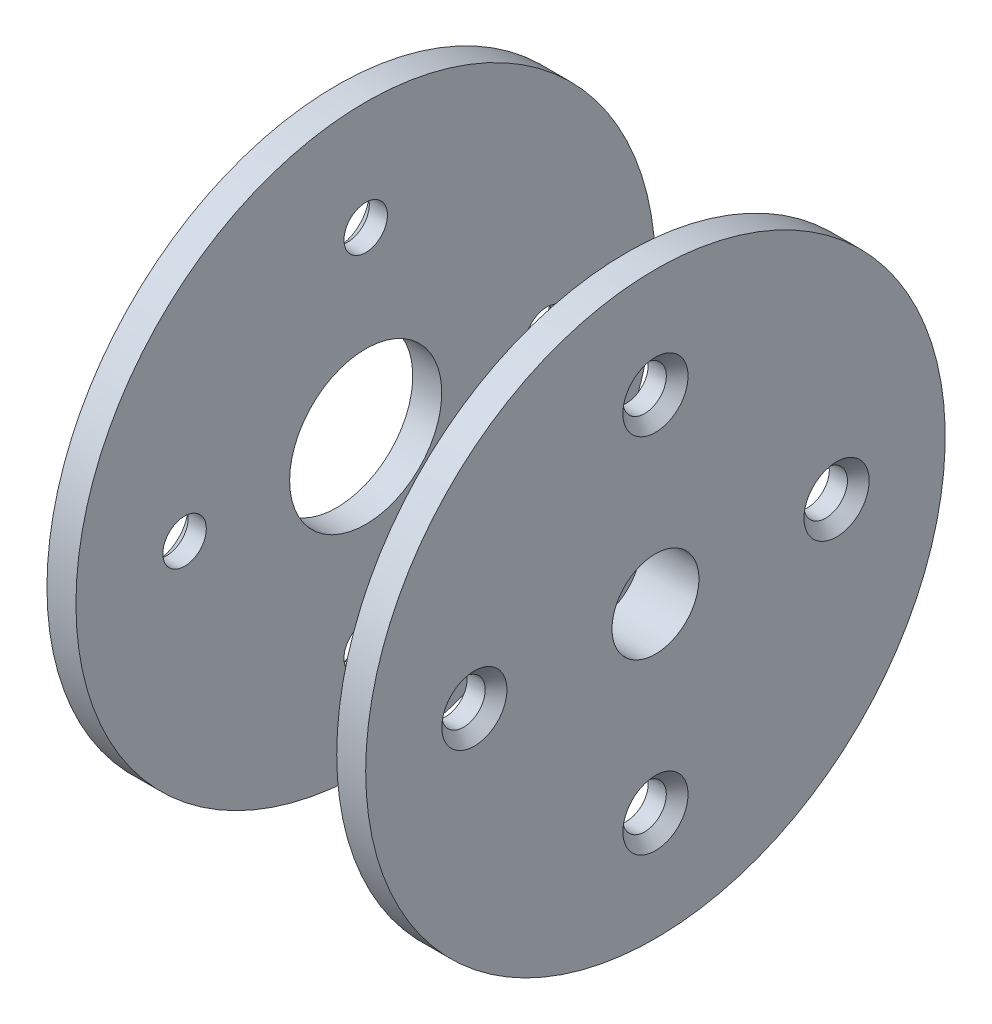
ISO-10303-21;
HEADER;
FILE_DESCRIPTION(('STEP AP214'),'2;1');
FILE_NAME('part.step','',(''),(''),'','','');
FILE_SCHEMA(('AUTOMOTIVE_DESIGN { 1 0 10303 214 1 1 1 1 }'));
ENDSEC;
DATA;
#1=APPLICATION_CONTEXT('core data for automotive mechanical design processes');
#2=APPLICATION_PROTOCOL_DEFINITION('international standard','automotive_design',2000,#1);
#3=PRODUCT_CONTEXT('',#1,'mechanical');
#4=PRODUCT('Part','Part','',(#3));
#5=PRODUCT_RELATED_PRODUCT_CATEGORY('part','',(#4));
#6=PRODUCT_DEFINITION_FORMATION('','',#4);
#7=PRODUCT_DEFINITION_CONTEXT('part definition',#1,'design');
#8=PRODUCT_DEFINITION('design','',#6,#7);
#9=PRODUCT_DEFINITION_SHAPE('','',#8);
#10=(LENGTH_UNIT() NAMED_UNIT(*) SI_UNIT(.MILLI.,.METRE.));
#11=(NAMED_UNIT(*) PLANE_ANGLE_UNIT() SI_UNIT($,.RADIAN.));
#12=(NAMED_UNIT(*) SI_UNIT($,.STERADIAN.) SOLID_ANGLE_UNIT());
#13=UNCERTAINTY_MEASURE_WITH_UNIT(LENGTH_MEASURE(1.E-05),#10,'distance_accuracy_value','');
#14=(GEOMETRIC_REPRESENTATION_CONTEXT(3) GLOBAL_UNCERTAINTY_ASSIGNED_CONTEXT((#13)) GLOBAL_UNIT_ASSIGNED_CONTEXT((#10,
#11,#12)) REPRESENTATION_CONTEXT('',''));
#15=CARTESIAN_POINT('',(0.,0.,0.));
#16=DIRECTION('',(0.,0.,1.));
#17=DIRECTION('',(1.,0.,0.));
#18=AXIS2_PLACEMENT_3D('',#15,#16,#17);
#19=CARTESIAN_POINT('',(0.,0.,0.));
#20=DIRECTION('',(-1.,0.,0.));
#21=DIRECTION('',(0.,0.,1.));
#22=AXIS2_PLACEMENT_3D('',#19,#20,#21);
#23=CYLINDRICAL_SURFACE('',#22,10.5);
#24=CARTESIAN_POINT('',(-25.,0.,0.));
#25=DIRECTION('',(-1.,0.,0.));
#26=DIRECTION('',(0.,0.,1.));
#27=AXIS2_PLACEMENT_3D('',#24,#25,#26);
#28=CIRCLE('',#27,10.5);
#29=CARTESIAN_POINT('',(-25.,0.,10.5));
#30=VERTEX_POINT('',#29);
#31=EDGE_CURVE('E93',#30,#30,#28,.T.);
#32=ORIENTED_EDGE('',*,*,#31,.F.);
#33=EDGE_LOOP('',(#32));
#34=FACE_BOUND('',#33,.T.);
#35=CARTESIAN_POINT('',(-29.,0.,0.));
#36=DIRECTION('',(-1.,0.,0.));
#37=DIRECTION('',(0.,0.,1.));
#38=AXIS2_PLACEMENT_3D('',#35,#36,#37);
#39=CIRCLE('',#38,10.5);
#40=CARTESIAN_POINT('',(-29.,0.,10.5));
#41=VERTEX_POINT('',#40);
#42=EDGE_CURVE('E88',#41,#41,#39,.T.);
#43=ORIENTED_EDGE('',*,*,#42,.T.);
#44=EDGE_LOOP('',(#43));
#45=FACE_BOUND('',#44,.T.);
#46=ADVANCED_FACE('F45',(#34,#45),#23,.F.);
#47=CARTESIAN_POINT('',(-29.,10.5,0.));
#48=DIRECTION('',(1.,0.,0.));
#49=DIRECTION('',(0.,0.,-1.));
#50=AXIS2_PLACEMENT_3D('',#47,#48,#49);
#51=PLANE('',#50);
#52=CARTESIAN_POINT('',(-29.,0.,-25.));
#53=DIRECTION('',(1.,0.,0.));
#54=DIRECTION('',(0.,0.,-1.));
#55=AXIS2_PLACEMENT_3D('',#52,#53,#54);
#56=CIRCLE('',#55,4.50000000000002);
#57=CARTESIAN_POINT('',(-29.,0.,-29.5));
#58=VERTEX_POINT('',#57);
#59=EDGE_CURVE('E72',#58,#58,#56,.T.);
#60=ORIENTED_EDGE('',*,*,#59,.T.);
#61=EDGE_LOOP('',(#60));
#62=FACE_BOUND('',#61,.T.);
#63=CARTESIAN_POINT('',(-29.,-25.,0.));
#64=DIRECTION('',(1.,0.,0.));
#65=DIRECTION('',(0.,0.,-1.));
#66=AXIS2_PLACEMENT_3D('',#63,#64,#65);
#67=CIRCLE('',#66,4.49999999999999);
#68=CARTESIAN_POINT('',(-29.,-25.,-4.49999999999999));
#69=VERTEX_POINT('',#68);
#70=EDGE_CURVE('E76',#69,#69,#67,.T.);
#71=ORIENTED_EDGE('',*,*,#70,.T.);
#72=EDGE_LOOP('',(#71));
#73=FACE_BOUND('',#72,.T.);
#74=CARTESIAN_POINT('',(-29.,0.,25.));
#75=DIRECTION('',(1.,0.,0.));
#76=DIRECTION('',(0.,0.,-1.));
#77=AXIS2_PLACEMENT_3D('',#74,#75,#76);
#78=CIRCLE('',#77,4.50000000000002);
#79=CARTESIAN_POINT('',(-29.,0.,20.5));
#80=VERTEX_POINT('',#79);
#81=EDGE_CURVE('E80',#80,#80,#78,.T.);
#82=ORIENTED_EDGE('',*,*,#81,.T.);
#83=EDGE_LOOP('',(#82));
#84=FACE_BOUND('',#83,.T.);
#85=CARTESIAN_POINT('',(-29.,25.,0.));
#86=DIRECTION('',(1.,0.,0.));
#87=DIRECTION('',(0.,0.,-1.));
#88=AXIS2_PLACEMENT_3D('',#85,#86,#87);
#89=CIRCLE('',#88,4.49999999999999);
#90=CARTESIAN_POINT('',(-29.,25.,-4.49999999999999));
#91=VERTEX_POINT('',#90);
#92=EDGE_CURVE('E84',#91,#91,#89,.T.);
#93=ORIENTED_EDGE('',*,*,#92,.T.);
#94=EDGE_LOOP('',(#93));
#95=FACE_BOUND('',#94,.T.);
#96=ORIENTED_EDGE('',*,*,#42,.F.);
#97=EDGE_LOOP('',(#96));
#98=FACE_BOUND('',#97,.T.);
#99=CARTESIAN_POINT('',(-29.,0.,0.));
#100=DIRECTION('',(-1.,0.,0.));
#101=DIRECTION('',(0.,0.,1.));
#102=AXIS2_PLACEMENT_3D('',#99,#100,#101);
#103=CIRCLE('',#102,40.);
#104=CARTESIAN_POINT('',(-29.,0.,40.));
#105=VERTEX_POINT('',#104);
#106=EDGE_CURVE('E109',#105,#105,#103,.T.);
#107=ORIENTED_EDGE('',*,*,#106,.T.);
#108=EDGE_LOOP('',(#107));
#109=FACE_BOUND('',#108,.T.);
#110=ADVANCED_FACE('F126',(#62,#73,#84,#95,#98,#109),#51,.F.);
#111=CARTESIAN_POINT('',(0.,0.,0.));
#112=DIRECTION('',(-1.,0.,0.));
#113=DIRECTION('',(0.,0.,1.));
#114=AXIS2_PLACEMENT_3D('',#111,#112,#113);
#115=CYLINDRICAL_SURFACE('',#114,40.);
#116=ORIENTED_EDGE('',*,*,#106,.F.);
#117=EDGE_LOOP('',(#116));
#118=FACE_BOUND('',#117,.T.);
#119=CARTESIAN_POINT('',(-25.,0.,0.));
#120=DIRECTION('',(-1.,0.,0.));
#121=DIRECTION('',(0.,0.,1.));
#122=AXIS2_PLACEMENT_3D('',#119,#120,#121);
#123=CIRCLE('',#122,40.);
#124=CARTESIAN_POINT('',(-25.,0.,40.));
#125=VERTEX_POINT('',#124);
#126=EDGE_CURVE('E113',#125,#125,#123,.T.);
#127=ORIENTED_EDGE('',*,*,#126,.T.);
#128=EDGE_LOOP('',(#127));
#129=FACE_BOUND('',#128,.T.);
#130=ADVANCED_FACE('F132',(#118,#129),#115,.T.);
#131=CARTESIAN_POINT('',(-25.,40.,0.));
#132=DIRECTION('',(-1.,0.,0.));
#133=DIRECTION('',(0.,0.,1.));
#134=AXIS2_PLACEMENT_3D('',#131,#132,#133);
#135=PLANE('',#134);
#136=CARTESIAN_POINT('',(-25.,0.,-25.));
#137=DIRECTION('',(-1.,0.,0.));
#138=DIRECTION('',(0.,0.,1.));
#139=AXIS2_PLACEMENT_3D('',#136,#137,#138);
#140=CIRCLE('',#139,3.);
#141=CARTESIAN_POINT('',(-25.,0.,-22.));
#142=VERTEX_POINT('',#141);
#143=EDGE_CURVE('E89',#142,#142,#140,.T.);
#144=ORIENTED_EDGE('',*,*,#143,.T.);
#145=EDGE_LOOP('',(#144));
#146=FACE_BOUND('',#145,.T.);
#147=CARTESIAN_POINT('',(-25.,-25.,0.));
#148=DIRECTION('',(-1.,0.,0.));
#149=DIRECTION('',(0.,0.,1.));
#150=AXIS2_PLACEMENT_3D('',#147,#148,#149);
#151=CIRCLE('',#150,3.);
#152=CARTESIAN_POINT('',(-25.,-25.,3.));
#153=VERTEX_POINT('',#152);
#154=EDGE_CURVE('E94',#153,#153,#151,.T.);
#155=ORIENTED_EDGE('',*,*,#154,.T.);
#156=EDGE_LOOP('',(#155));
#157=FACE_BOUND('',#156,.T.);
#158=CARTESIAN_POINT('',(-25.,0.,25.));
#159=DIRECTION('',(-1.,0.,0.));
#160=DIRECTION('',(0.,0.,1.));
#161=AXIS2_PLACEMENT_3D('',#158,#159,#160);
#162=CIRCLE('',#161,3.);
#163=CARTESIAN_POINT('',(-25.,0.,28.));
#164=VERTEX_POINT('',#163);
#165=EDGE_CURVE('E98',#164,#164,#162,.T.);
#166=ORIENTED_EDGE('',*,*,#165,.T.);
#167=EDGE_LOOP('',(#166));
#168=FACE_BOUND('',#167,.T.);
#169=CARTESIAN_POINT('',(-25.,25.,0.));
#170=DIRECTION('',(-1.,0.,0.));
#171=DIRECTION('',(0.,0.,1.));
#172=AXIS2_PLACEMENT_3D('',#169,#170,#171);
#173=CIRCLE('',#172,3.);
#174=CARTESIAN_POINT('',(-25.,25.,3.));
#175=VERTEX_POINT('',#174);
#176=EDGE_CURVE('E102',#175,#175,#173,.T.);
#177=ORIENTED_EDGE('',*,*,#176,.T.);
#178=EDGE_LOOP('',(#177));
#179=FACE_BOUND('',#178,.T.);
#180=ORIENTED_EDGE('',*,*,#126,.F.);
#181=EDGE_LOOP('',(#180));
#182=FACE_BOUND('',#181,.T.);
#183=ORIENTED_EDGE('',*,*,#31,.T.);
#184=EDGE_LOOP('',(#183));
#185=FACE_BOUND('',#184,.T.);
#186=ADVANCED_FACE('F122',(#146,#157,#168,#179,#182,#185),#135,.F.);
#187=CARTESIAN_POINT('',(-29.,25.,0.));
#188=DIRECTION('',(1.,0.,0.));
#189=DIRECTION('',(0.,0.,-1.));
#190=AXIS2_PLACEMENT_3D('',#187,#188,#189);
#191=CYLINDRICAL_SURFACE('',#190,3.);
#192=CARTESIAN_POINT('',(-27.5,25.,0.));
#193=DIRECTION('',(1.,0.,0.));
#194=DIRECTION('',(0.,0.,-1.));
#195=AXIS2_PLACEMENT_3D('',#192,#193,#194);
#196=CIRCLE('',#195,3.);
#197=CARTESIAN_POINT('',(-27.5,25.,-3.));
#198=VERTEX_POINT('',#197);
#199=EDGE_CURVE('E11',#198,#198,#196,.F.);
#200=ORIENTED_EDGE('',*,*,#199,.T.);
#201=EDGE_LOOP('',(#200));
#202=FACE_BOUND('',#201,.T.);
#203=ORIENTED_EDGE('',*,*,#176,.F.);
#204=EDGE_LOOP('',(#203));
#205=FACE_BOUND('',#204,.T.);
#206=ADVANCED_FACE('F143',(#202,#205),#191,.F.);
#207=CARTESIAN_POINT('',(-29.,0.,25.));
#208=DIRECTION('',(1.,0.,0.));
#209=DIRECTION('',(0.,0.,-1.));
#210=AXIS2_PLACEMENT_3D('',#207,#208,#209);
#211=CYLINDRICAL_SURFACE('',#210,3.);
#212=CARTESIAN_POINT('',(-27.5,0.,25.));
#213=DIRECTION('',(1.,0.,0.));
#214=DIRECTION('',(0.,0.,-1.));
#215=AXIS2_PLACEMENT_3D('',#212,#213,#214);
#216=CIRCLE('',#215,3.);
#217=CARTESIAN_POINT('',(-27.5,0.,22.));
#218=VERTEX_POINT('',#217);
#219=EDGE_CURVE('E54',#218,#218,#216,.F.);
#220=ORIENTED_EDGE('',*,*,#219,.T.);
#221=EDGE_LOOP('',(#220));
#222=FACE_BOUND('',#221,.T.);
#223=ORIENTED_EDGE('',*,*,#165,.F.);
#224=EDGE_LOOP('',(#223));
#225=FACE_BOUND('',#224,.T.);
#226=ADVANCED_FACE('F149',(#222,#225),#211,.F.);
#227=CARTESIAN_POINT('',(-29.,-25.,0.));
#228=DIRECTION('',(1.,0.,0.));
#229=DIRECTION('',(0.,0.,-1.));
#230=AXIS2_PLACEMENT_3D('',#227,#228,#229);
#231=CYLINDRICAL_SURFACE('',#230,3.);
#232=CARTESIAN_POINT('',(-27.5,-25.,0.));
#233=DIRECTION('',(1.,0.,0.));
#234=DIRECTION('',(0.,0.,-1.));
#235=AXIS2_PLACEMENT_3D('',#232,#233,#234);
#236=CIRCLE('',#235,3.);
#237=CARTESIAN_POINT('',(-27.5,-25.,-3.));
#238=VERTEX_POINT('',#237);
#239=EDGE_CURVE('E60',#238,#238,#236,.F.);
#240=ORIENTED_EDGE('',*,*,#239,.T.);
#241=EDGE_LOOP('',(#240));
#242=FACE_BOUND('',#241,.T.);
#243=ORIENTED_EDGE('',*,*,#154,.F.);
#244=EDGE_LOOP('',(#243));
#245=FACE_BOUND('',#244,.T.);
#246=ADVANCED_FACE('F211',(#242,#245),#231,.F.);
#247=CARTESIAN_POINT('',(-29.,0.,-25.));
#248=DIRECTION('',(1.,0.,0.));
#249=DIRECTION('',(0.,0.,-1.));
#250=AXIS2_PLACEMENT_3D('',#247,#248,#249);
#251=CYLINDRICAL_SURFACE('',#250,3.);
#252=CARTESIAN_POINT('',(-27.5,0.,-25.));
#253=DIRECTION('',(1.,0.,0.));
#254=DIRECTION('',(0.,0.,-1.));
#255=AXIS2_PLACEMENT_3D('',#252,#253,#254);
#256=CIRCLE('',#255,3.);
#257=CARTESIAN_POINT('',(-27.5,0.,-28.));
#258=VERTEX_POINT('',#257);
#259=EDGE_CURVE('E66',#258,#258,#256,.F.);
#260=ORIENTED_EDGE('',*,*,#259,.T.);
#261=EDGE_LOOP('',(#260));
#262=FACE_BOUND('',#261,.T.);
#263=ORIENTED_EDGE('',*,*,#143,.F.);
#264=EDGE_LOOP('',(#263));
#265=FACE_BOUND('',#264,.T.);
#266=ADVANCED_FACE('F162',(#262,#265),#251,.F.);
#267=CARTESIAN_POINT('',(-29.,0.,-25.));
#268=DIRECTION('',(-1.,0.,0.));
#269=DIRECTION('',(0.,0.,1.));
#270=AXIS2_PLACEMENT_3D('',#267,#268,#269);
#271=CONICAL_SURFACE('',#270,4.50000000000002,0.785398163397449);
#272=ORIENTED_EDGE('',*,*,#259,.F.);
#273=EDGE_LOOP('',(#272));
#274=FACE_BOUND('',#273,.T.);
#275=ORIENTED_EDGE('',*,*,#59,.F.);
#276=EDGE_LOOP('',(#275));
#277=FACE_BOUND('',#276,.T.);
#278=ADVANCED_FACE('F155',(#274,#277),#271,.F.);
#279=CARTESIAN_POINT('',(-29.,-25.,0.));
#280=DIRECTION('',(-1.,0.,0.));
#281=DIRECTION('',(0.,0.,1.));
#282=AXIS2_PLACEMENT_3D('',#279,#280,#281);
#283=CONICAL_SURFACE('',#282,4.49999999999999,0.785398163397442);
#284=ORIENTED_EDGE('',*,*,#239,.F.);
#285=EDGE_LOOP('',(#284));
#286=FACE_BOUND('',#285,.T.);
#287=ORIENTED_EDGE('',*,*,#70,.F.);
#288=EDGE_LOOP('',(#287));
#289=FACE_BOUND('',#288,.T.);
#290=ADVANCED_FACE('F161',(#286,#289),#283,.F.);
#291=CARTESIAN_POINT('',(-29.,0.,25.));
#292=DIRECTION('',(-1.,0.,0.));
#293=DIRECTION('',(0.,0.,1.));
#294=AXIS2_PLACEMENT_3D('',#291,#292,#293);
#295=CONICAL_SURFACE('',#294,4.50000000000002,0.785398163397449);
#296=ORIENTED_EDGE('',*,*,#219,.F.);
#297=EDGE_LOOP('',(#296));
#298=FACE_BOUND('',#297,.T.);
#299=ORIENTED_EDGE('',*,*,#81,.F.);
#300=EDGE_LOOP('',(#299));
#301=FACE_BOUND('',#300,.T.);
#302=ADVANCED_FACE('F168',(#298,#301),#295,.F.);
#303=CARTESIAN_POINT('',(-29.,25.,0.));
#304=DIRECTION('',(-1.,0.,0.));
#305=DIRECTION('',(0.,0.,1.));
#306=AXIS2_PLACEMENT_3D('',#303,#304,#305);
#307=CONICAL_SURFACE('',#306,4.49999999999999,0.785398163397442);
#308=ORIENTED_EDGE('',*,*,#199,.F.);
#309=EDGE_LOOP('',(#308));
#310=FACE_BOUND('',#309,.T.);
#311=ORIENTED_EDGE('',*,*,#92,.F.);
#312=EDGE_LOOP('',(#311));
#313=FACE_BOUND('',#312,.T.);
#314=ADVANCED_FACE('F48',(#310,#313),#307,.F.);
#315=CLOSED_SHELL('',(#46,#110,#130,#186,#206,#226,#246,#266,#278,#290,#302,#314));
#316=MANIFOLD_SOLID_BREP('B2',#315);
#317=CARTESIAN_POINT('',(0.,3.25,0.));
#318=DIRECTION('',(1.,0.,0.));
#319=DIRECTION('',(0.,0.,-1.));
#320=AXIS2_PLACEMENT_3D('',#317,#318,#319);
#321=PLANE('',#320);
#322=CARTESIAN_POINT('',(0.,0.,0.));
#323=DIRECTION('',(-1.,0.,0.));
#324=DIRECTION('',(0.,0.,1.));
#325=AXIS2_PLACEMENT_3D('',#322,#323,#324);
#326=CIRCLE('',#325,3.25);
#327=CARTESIAN_POINT('',(0.,0.,3.25));
#328=VERTEX_POINT('',#327);
#329=EDGE_CURVE('E390',#328,#328,#326,.T.);
#330=ORIENTED_EDGE('',*,*,#329,.F.);
#331=EDGE_LOOP('',(#330));
#332=FACE_BOUND('',#331,.T.);
#333=CARTESIAN_POINT('',(0.,0.,0.));
#334=DIRECTION('',(-1.,0.,0.));
#335=DIRECTION('',(0.,0.,1.));
#336=AXIS2_PLACEMENT_3D('',#333,#334,#335);
#337=CIRCLE('',#336,10.5);
#338=CARTESIAN_POINT('',(0.,0.,10.5));
#339=VERTEX_POINT('',#338);
#340=EDGE_CURVE('E362',#339,#339,#337,.T.);
#341=ORIENTED_EDGE('',*,*,#340,.T.);
#342=EDGE_LOOP('',(#341));
#343=FACE_BOUND('',#342,.T.);
#344=ADVANCED_FACE('F319',(#332,#343),#321,.F.);
#345=CARTESIAN_POINT('',(0.,0.,0.));
#346=DIRECTION('',(-1.,0.,0.));
#347=DIRECTION('',(0.,0.,1.));
#348=AXIS2_PLACEMENT_3D('',#345,#346,#347);
#349=CYLINDRICAL_SURFACE('',#348,10.5);
#350=ORIENTED_EDGE('',*,*,#340,.F.);
#351=EDGE_LOOP('',(#350));
#352=FACE_BOUND('',#351,.T.);
#353=CARTESIAN_POINT('',(11.,0.,0.));
#354=DIRECTION('',(-1.,0.,0.));
#355=DIRECTION('',(0.,0.,1.));
#356=AXIS2_PLACEMENT_3D('',#353,#354,#355);
#357=CIRCLE('',#356,10.5);
#358=CARTESIAN_POINT('',(11.,0.,10.5));
#359=VERTEX_POINT('',#358);
#360=EDGE_CURVE('E366',#359,#359,#357,.T.);
#361=ORIENTED_EDGE('',*,*,#360,.T.);
#362=EDGE_LOOP('',(#361));
#363=FACE_BOUND('',#362,.T.);
#364=ADVANCED_FACE('F431',(#352,#363),#349,.T.);
#365=CARTESIAN_POINT('',(11.,10.5,0.));
#366=DIRECTION('',(1.,0.,0.));
#367=DIRECTION('',(0.,0.,-1.));
#368=AXIS2_PLACEMENT_3D('',#365,#366,#367);
#369=PLANE('',#368);
#370=CARTESIAN_POINT('',(11.,0.,-25.));
#371=DIRECTION('',(1.,0.,0.));
#372=DIRECTION('',(0.,0.,-1.));
#373=AXIS2_PLACEMENT_3D('',#370,#371,#372);
#374=CIRCLE('',#373,3.);
#375=CARTESIAN_POINT('',(11.,0.,-28.));
#376=VERTEX_POINT('',#375);
#377=EDGE_CURVE('E394',#376,#376,#374,.T.);
#378=ORIENTED_EDGE('',*,*,#377,.T.);
#379=EDGE_LOOP('',(#378));
#380=FACE_BOUND('',#379,.T.);
#381=CARTESIAN_POINT('',(11.,-25.,0.));
#382=DIRECTION('',(1.,0.,0.));
#383=DIRECTION('',(0.,0.,-1.));
#384=AXIS2_PLACEMENT_3D('',#381,#382,#383);
#385=CIRCLE('',#384,3.);
#386=CARTESIAN_POINT('',(11.,-25.,-3.));
#387=VERTEX_POINT('',#386);
#388=EDGE_CURVE('E398',#387,#387,#385,.T.);
#389=ORIENTED_EDGE('',*,*,#388,.T.);
#390=EDGE_LOOP('',(#389));
#391=FACE_BOUND('',#390,.T.);
#392=CARTESIAN_POINT('',(11.,0.,25.));
#393=DIRECTION('',(1.,0.,0.));
#394=DIRECTION('',(0.,0.,-1.));
#395=AXIS2_PLACEMENT_3D('',#392,#393,#394);
#396=CIRCLE('',#395,3.);
#397=CARTESIAN_POINT('',(11.,0.,22.));
#398=VERTEX_POINT('',#397);
#399=EDGE_CURVE('E402',#398,#398,#396,.T.);
#400=ORIENTED_EDGE('',*,*,#399,.T.);
#401=EDGE_LOOP('',(#400));
#402=FACE_BOUND('',#401,.T.);
#403=CARTESIAN_POINT('',(11.,25.,0.));
#404=DIRECTION('',(1.,0.,0.));
#405=DIRECTION('',(0.,0.,-1.));
#406=AXIS2_PLACEMENT_3D('',#403,#404,#405);
#407=CIRCLE('',#406,3.);
#408=CARTESIAN_POINT('',(11.,25.,-3.));
#409=VERTEX_POINT('',#408);
#410=EDGE_CURVE('E406',#409,#409,#407,.T.);
#411=ORIENTED_EDGE('',*,*,#410,.T.);
#412=EDGE_LOOP('',(#411));
#413=FACE_BOUND('',#412,.T.);
#414=ORIENTED_EDGE('',*,*,#360,.F.);
#415=EDGE_LOOP('',(#414));
#416=FACE_BOUND('',#415,.T.);
#417=CARTESIAN_POINT('',(11.,0.,0.));
#418=DIRECTION('',(-1.,0.,0.));
#419=DIRECTION('',(0.,0.,1.));
#420=AXIS2_PLACEMENT_3D('',#417,#418,#419);
#421=CIRCLE('',#420,40.);
#422=CARTESIAN_POINT('',(11.,0.,40.));
#423=VERTEX_POINT('',#422);
#424=EDGE_CURVE('E370',#423,#423,#421,.T.);
#425=ORIENTED_EDGE('',*,*,#424,.T.);
#426=EDGE_LOOP('',(#425));
#427=FACE_BOUND('',#426,.T.);
#428=ADVANCED_FACE('F412',(#380,#391,#402,#413,#416,#427),#369,.F.);
#429=CARTESIAN_POINT('',(0.,0.,0.));
#430=DIRECTION('',(-1.,0.,0.));
#431=DIRECTION('',(0.,0.,1.));
#432=AXIS2_PLACEMENT_3D('',#429,#430,#431);
#433=CYLINDRICAL_SURFACE('',#432,40.);
#434=ORIENTED_EDGE('',*,*,#424,.F.);
#435=EDGE_LOOP('',(#434));
#436=FACE_BOUND('',#435,.T.);
#437=CARTESIAN_POINT('',(15.,0.,0.));
#438=DIRECTION('',(-1.,0.,0.));
#439=DIRECTION('',(0.,0.,1.));
#440=AXIS2_PLACEMENT_3D('',#437,#438,#439);
#441=CIRCLE('',#440,40.);
#442=CARTESIAN_POINT('',(15.,0.,40.));
#443=VERTEX_POINT('',#442);
#444=EDGE_CURVE('E374',#443,#443,#441,.T.);
#445=ORIENTED_EDGE('',*,*,#444,.T.);
#446=EDGE_LOOP('',(#445));
#447=FACE_BOUND('',#446,.T.);
#448=ADVANCED_FACE('F474',(#436,#447),#433,.T.);
#449=CARTESIAN_POINT('',(15.,40.,0.));
#450=DIRECTION('',(-1.,0.,0.));
#451=DIRECTION('',(0.,0.,1.));
#452=AXIS2_PLACEMENT_3D('',#449,#450,#451);
#453=PLANE('',#452);
#454=CARTESIAN_POINT('',(15.,-25.,0.));
#455=DIRECTION('',(-1.,0.,0.));
#456=DIRECTION('',(0.,0.,1.));
#457=AXIS2_PLACEMENT_3D('',#454,#455,#456);
#458=CIRCLE('',#457,4.50000000000001);
#459=CARTESIAN_POINT('',(15.,-25.,4.50000000000001));
#460=VERTEX_POINT('',#459);
#461=EDGE_CURVE('E340',#460,#460,#458,.T.);
#462=ORIENTED_EDGE('',*,*,#461,.T.);
#463=EDGE_LOOP('',(#462));
#464=FACE_BOUND('',#463,.T.);
#465=CARTESIAN_POINT('',(15.,0.,25.));
#466=DIRECTION('',(-1.,0.,0.));
#467=DIRECTION('',(0.,0.,1.));
#468=AXIS2_PLACEMENT_3D('',#465,#466,#467);
#469=CIRCLE('',#468,4.50000000000001);
#470=CARTESIAN_POINT('',(15.,0.,29.5));
#471=VERTEX_POINT('',#470);
#472=EDGE_CURVE('E346',#471,#471,#469,.T.);
#473=ORIENTED_EDGE('',*,*,#472,.T.);
#474=EDGE_LOOP('',(#473));
#475=FACE_BOUND('',#474,.T.);
#476=CARTESIAN_POINT('',(15.,0.,-25.));
#477=DIRECTION('',(-1.,0.,0.));
#478=DIRECTION('',(0.,0.,1.));
#479=AXIS2_PLACEMENT_3D('',#476,#477,#478);
#480=CIRCLE('',#479,4.50000000000001);
#481=CARTESIAN_POINT('',(15.,0.,-20.5));
#482=VERTEX_POINT('',#481);
#483=EDGE_CURVE('E350',#482,#482,#480,.T.);
#484=ORIENTED_EDGE('',*,*,#483,.T.);
#485=EDGE_LOOP('',(#484));
#486=FACE_BOUND('',#485,.T.);
#487=CARTESIAN_POINT('',(15.,25.,0.));
#488=DIRECTION('',(-1.,0.,0.));
#489=DIRECTION('',(0.,0.,1.));
#490=AXIS2_PLACEMENT_3D('',#487,#488,#489);
#491=CIRCLE('',#490,4.50000000000001);
#492=CARTESIAN_POINT('',(15.,25.,4.50000000000001));
#493=VERTEX_POINT('',#492);
#494=EDGE_CURVE('E354',#493,#493,#491,.T.);
#495=ORIENTED_EDGE('',*,*,#494,.T.);
#496=EDGE_LOOP('',(#495));
#497=FACE_BOUND('',#496,.T.);
#498=ORIENTED_EDGE('',*,*,#444,.F.);
#499=EDGE_LOOP('',(#498));
#500=FACE_BOUND('',#499,.T.);
#501=CARTESIAN_POINT('',(15.,0.,0.));
#502=DIRECTION('',(-1.,0.,0.));
#503=DIRECTION('',(0.,0.,1.));
#504=AXIS2_PLACEMENT_3D('',#501,#502,#503);
#505=CIRCLE('',#504,6.);
#506=CARTESIAN_POINT('',(15.,0.,6.));
#507=VERTEX_POINT('',#506);
#508=EDGE_CURVE('E378',#507,#507,#505,.T.);
#509=ORIENTED_EDGE('',*,*,#508,.T.);
#510=EDGE_LOOP('',(#509));
#511=FACE_BOUND('',#510,.T.);
#512=ADVANCED_FACE('F470',(#464,#475,#486,#497,#500,#511),#453,.F.);
#513=CARTESIAN_POINT('',(0.,0.,0.));
#514=DIRECTION('',(-1.,0.,0.));
#515=DIRECTION('',(0.,0.,1.));
#516=AXIS2_PLACEMENT_3D('',#513,#514,#515);
#517=CYLINDRICAL_SURFACE('',#516,6.);
#518=ORIENTED_EDGE('',*,*,#508,.F.);
#519=EDGE_LOOP('',(#518));
#520=FACE_BOUND('',#519,.T.);
#521=CARTESIAN_POINT('',(7.,0.,0.));
#522=DIRECTION('',(-1.,0.,0.));
#523=DIRECTION('',(0.,0.,1.));
#524=AXIS2_PLACEMENT_3D('',#521,#522,#523);
#525=CIRCLE('',#524,6.);
#526=CARTESIAN_POINT('',(7.,0.,6.));
#527=VERTEX_POINT('',#526);
#528=EDGE_CURVE('E382',#527,#527,#525,.T.);
#529=ORIENTED_EDGE('',*,*,#528,.T.);
#530=EDGE_LOOP('',(#529));
#531=FACE_BOUND('',#530,.T.);
#532=ADVANCED_FACE('F473',(#520,#531),#517,.F.);
#533=CARTESIAN_POINT('',(7.,6.,0.));
#534=DIRECTION('',(-1.,0.,0.));
#535=DIRECTION('',(0.,0.,1.));
#536=AXIS2_PLACEMENT_3D('',#533,#534,#535);
#537=PLANE('',#536);
#538=ORIENTED_EDGE('',*,*,#528,.F.);
#539=EDGE_LOOP('',(#538));
#540=FACE_BOUND('',#539,.T.);
#541=CARTESIAN_POINT('',(7.,0.,0.));
#542=DIRECTION('',(-1.,0.,0.));
#543=DIRECTION('',(0.,0.,1.));
#544=AXIS2_PLACEMENT_3D('',#541,#542,#543);
#545=CIRCLE('',#544,3.25);
#546=CARTESIAN_POINT('',(7.,0.,3.25));
#547=VERTEX_POINT('',#546);
#548=EDGE_CURVE('E386',#547,#547,#545,.T.);
#549=ORIENTED_EDGE('',*,*,#548,.T.);
#550=EDGE_LOOP('',(#549));
#551=FACE_BOUND('',#550,.T.);
#552=ADVANCED_FACE('F427',(#540,#551),#537,.F.);
#553=CARTESIAN_POINT('',(0.,0.,0.));
#554=DIRECTION('',(-1.,0.,0.));
#555=DIRECTION('',(0.,0.,1.));
#556=AXIS2_PLACEMENT_3D('',#553,#554,#555);
#557=CYLINDRICAL_SURFACE('',#556,3.25);
#558=ORIENTED_EDGE('',*,*,#548,.F.);
#559=EDGE_LOOP('',(#558));
#560=FACE_BOUND('',#559,.T.);
#561=ORIENTED_EDGE('',*,*,#329,.T.);
#562=EDGE_LOOP('',(#561));
#563=FACE_BOUND('',#562,.T.);
#564=ADVANCED_FACE('F418',(#560,#563),#557,.F.);
#565=CARTESIAN_POINT('',(-29.,25.,0.));
#566=DIRECTION('',(1.,0.,0.));
#567=DIRECTION('',(0.,0.,-1.));
#568=AXIS2_PLACEMENT_3D('',#565,#566,#567);
#569=CYLINDRICAL_SURFACE('',#568,3.);
#570=CARTESIAN_POINT('',(13.5,25.,0.));
#571=DIRECTION('',(-1.,0.,0.));
#572=DIRECTION('',(0.,0.,1.));
#573=AXIS2_PLACEMENT_3D('',#570,#571,#572);
#574=CIRCLE('',#573,3.);
#575=CARTESIAN_POINT('',(13.5,25.,3.));
#576=VERTEX_POINT('',#575);
#577=EDGE_CURVE('E44',#576,#576,#574,.F.);
#578=ORIENTED_EDGE('',*,*,#577,.T.);
#579=EDGE_LOOP('',(#578));
#580=FACE_BOUND('',#579,.T.);
#581=ORIENTED_EDGE('',*,*,#410,.F.);
#582=EDGE_LOOP('',(#581));
#583=FACE_BOUND('',#582,.T.);
#584=ADVANCED_FACE('F415',(#580,#583),#569,.F.);
#585=CARTESIAN_POINT('',(-29.,0.,25.));
#586=DIRECTION('',(1.,0.,0.));
#587=DIRECTION('',(0.,0.,-1.));
#588=AXIS2_PLACEMENT_3D('',#585,#586,#587);
#589=CYLINDRICAL_SURFACE('',#588,3.);
#590=CARTESIAN_POINT('',(13.5,0.,25.));
#591=DIRECTION('',(-1.,0.,0.));
#592=DIRECTION('',(0.,0.,1.));
#593=AXIS2_PLACEMENT_3D('',#590,#591,#592);
#594=CIRCLE('',#593,3.);
#595=CARTESIAN_POINT('',(13.5,0.,28.));
#596=VERTEX_POINT('',#595);
#597=EDGE_CURVE('E334',#596,#596,#594,.F.);
#598=ORIENTED_EDGE('',*,*,#597,.T.);
#599=EDGE_LOOP('',(#598));
#600=FACE_BOUND('',#599,.T.);
#601=ORIENTED_EDGE('',*,*,#399,.F.);
#602=EDGE_LOOP('',(#601));
#603=FACE_BOUND('',#602,.T.);
#604=ADVANCED_FACE('F417',(#600,#603),#589,.F.);
#605=CARTESIAN_POINT('',(-29.,-25.,0.));
#606=DIRECTION('',(1.,0.,0.));
#607=DIRECTION('',(0.,0.,-1.));
#608=AXIS2_PLACEMENT_3D('',#605,#606,#607);
#609=CYLINDRICAL_SURFACE('',#608,3.);
#610=CARTESIAN_POINT('',(13.5,-25.,0.));
#611=DIRECTION('',(-1.,0.,0.));
#612=DIRECTION('',(0.,0.,1.));
#613=AXIS2_PLACEMENT_3D('',#610,#611,#612);
#614=CIRCLE('',#613,3.);
#615=CARTESIAN_POINT('',(13.5,-25.,3.));
#616=VERTEX_POINT('',#615);
#617=EDGE_CURVE('E358',#616,#616,#614,.F.);
#618=ORIENTED_EDGE('',*,*,#617,.T.);
#619=EDGE_LOOP('',(#618));
#620=FACE_BOUND('',#619,.T.);
#621=ORIENTED_EDGE('',*,*,#388,.F.);
#622=EDGE_LOOP('',(#621));
#623=FACE_BOUND('',#622,.T.);
#624=ADVANCED_FACE('F424',(#620,#623),#609,.F.);
#625=CARTESIAN_POINT('',(-29.,0.,-25.));
#626=DIRECTION('',(1.,0.,0.));
#627=DIRECTION('',(0.,0.,-1.));
#628=AXIS2_PLACEMENT_3D('',#625,#626,#627);
#629=CYLINDRICAL_SURFACE('',#628,3.);
#630=CARTESIAN_POINT('',(13.5,0.,-25.));
#631=DIRECTION('',(-1.,0.,0.));
#632=DIRECTION('',(0.,0.,1.));
#633=AXIS2_PLACEMENT_3D('',#630,#631,#632);
#634=CIRCLE('',#633,3.);
#635=CARTESIAN_POINT('',(13.5,0.,-22.));
#636=VERTEX_POINT('',#635);
#637=EDGE_CURVE('E328',#636,#636,#634,.F.);
#638=ORIENTED_EDGE('',*,*,#637,.T.);
#639=EDGE_LOOP('',(#638));
#640=FACE_BOUND('',#639,.T.);
#641=ORIENTED_EDGE('',*,*,#377,.F.);
#642=EDGE_LOOP('',(#641));
#643=FACE_BOUND('',#642,.T.);
#644=ADVANCED_FACE('F451',(#640,#643),#629,.F.);
#645=CARTESIAN_POINT('',(13.5,-25.,0.));
#646=DIRECTION('',(1.,0.,0.));
#647=DIRECTION('',(0.,0.,-1.));
#648=AXIS2_PLACEMENT_3D('',#645,#646,#647);
#649=CONICAL_SURFACE('',#648,3.,0.785398163397451);
#650=ORIENTED_EDGE('',*,*,#461,.F.);
#651=EDGE_LOOP('',(#650));
#652=FACE_BOUND('',#651,.T.);
#653=ORIENTED_EDGE('',*,*,#617,.F.);
#654=EDGE_LOOP('',(#653));
#655=FACE_BOUND('',#654,.T.);
#656=ADVANCED_FACE('F444',(#652,#655),#649,.F.);
#657=CARTESIAN_POINT('',(13.5,0.,25.));
#658=DIRECTION('',(1.,0.,0.));
#659=DIRECTION('',(0.,0.,-1.));
#660=AXIS2_PLACEMENT_3D('',#657,#658,#659);
#661=CONICAL_SURFACE('',#660,3.,0.785398163397451);
#662=ORIENTED_EDGE('',*,*,#472,.F.);
#663=EDGE_LOOP('',(#662));
#664=FACE_BOUND('',#663,.T.);
#665=ORIENTED_EDGE('',*,*,#597,.F.);
#666=EDGE_LOOP('',(#665));
#667=FACE_BOUND('',#666,.T.);
#668=ADVANCED_FACE('F450',(#664,#667),#661,.F.);
#669=CARTESIAN_POINT('',(13.5,0.,-25.));
#670=DIRECTION('',(1.,0.,0.));
#671=DIRECTION('',(0.,0.,-1.));
#672=AXIS2_PLACEMENT_3D('',#669,#670,#671);
#673=CONICAL_SURFACE('',#672,3.,0.785398163397451);
#674=ORIENTED_EDGE('',*,*,#483,.F.);
#675=EDGE_LOOP('',(#674));
#676=FACE_BOUND('',#675,.T.);
#677=ORIENTED_EDGE('',*,*,#637,.F.);
#678=EDGE_LOOP('',(#677));
#679=FACE_BOUND('',#678,.T.);
#680=ADVANCED_FACE('F457',(#676,#679),#673,.F.);
#681=CARTESIAN_POINT('',(13.5,25.,0.));
#682=DIRECTION('',(1.,0.,0.));
#683=DIRECTION('',(0.,0.,-1.));
#684=AXIS2_PLACEMENT_3D('',#681,#682,#683);
#685=CONICAL_SURFACE('',#684,3.,0.785398163397451);
#686=ORIENTED_EDGE('',*,*,#494,.F.);
#687=EDGE_LOOP('',(#686));
#688=FACE_BOUND('',#687,.T.);
#689=ORIENTED_EDGE('',*,*,#577,.F.);
#690=EDGE_LOOP('',(#689));
#691=FACE_BOUND('',#690,.T.);
#692=ADVANCED_FACE('F322',(#688,#691),#685,.F.);
#693=CLOSED_SHELL('',(#344,#364,#428,#448,#512,#532,#552,#564,#584,#604,#624,#644,#656,#668,
#680,#692));
#694=MANIFOLD_SOLID_BREP('B6',#693);
#695=ADVANCED_BREP_SHAPE_REPRESENTATION('',(#18,#316,#694),#14);
#696=SHAPE_DEFINITION_REPRESENTATION(#9,#695);
ENDSEC;
END-ISO-10303-21;
